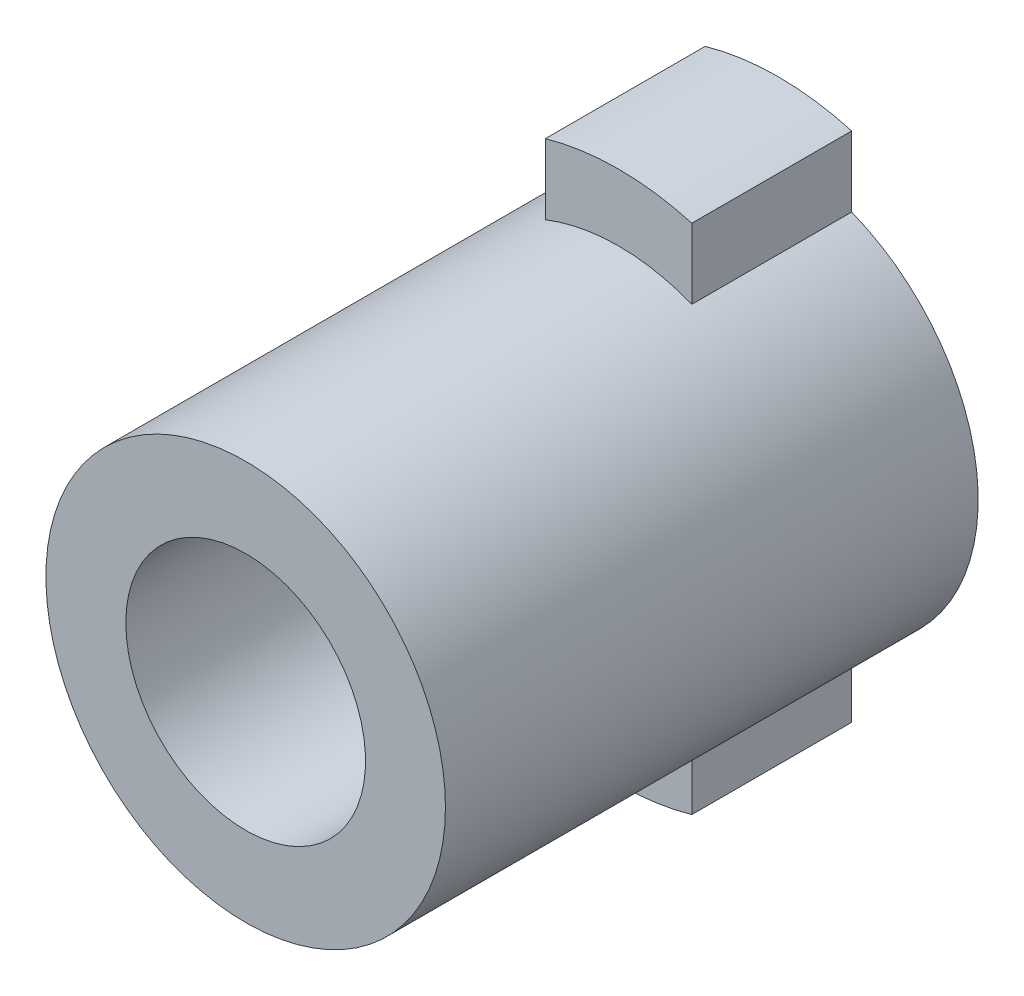
ISO-10303-21;
HEADER;
FILE_DESCRIPTION(('STEP AP214'),'2;1');
FILE_NAME('part.step','',(''),(''),'','','');
FILE_SCHEMA(('AUTOMOTIVE_DESIGN { 1 0 10303 214 1 1 1 1 }'));
ENDSEC;
DATA;
#1=APPLICATION_CONTEXT('core data for automotive mechanical design processes');
#2=APPLICATION_PROTOCOL_DEFINITION('international standard','automotive_design',2000,#1);
#3=PRODUCT_CONTEXT('',#1,'mechanical');
#4=PRODUCT('Part','Part','',(#3));
#5=PRODUCT_RELATED_PRODUCT_CATEGORY('part','',(#4));
#6=PRODUCT_DEFINITION_FORMATION('','',#4);
#7=PRODUCT_DEFINITION_CONTEXT('part definition',#1,'design');
#8=PRODUCT_DEFINITION('design','',#6,#7);
#9=PRODUCT_DEFINITION_SHAPE('','',#8);
#10=(LENGTH_UNIT() NAMED_UNIT(*) SI_UNIT(.MILLI.,.METRE.));
#11=(NAMED_UNIT(*) PLANE_ANGLE_UNIT() SI_UNIT($,.RADIAN.));
#12=(NAMED_UNIT(*) SI_UNIT($,.STERADIAN.) SOLID_ANGLE_UNIT());
#13=UNCERTAINTY_MEASURE_WITH_UNIT(LENGTH_MEASURE(1.E-05),#10,'distance_accuracy_value','');
#14=(GEOMETRIC_REPRESENTATION_CONTEXT(3) GLOBAL_UNCERTAINTY_ASSIGNED_CONTEXT((#13)) GLOBAL_UNIT_ASSIGNED_CONTEXT((#10,
#11,#12)) REPRESENTATION_CONTEXT('',''));
#15=CARTESIAN_POINT('',(0.,0.,0.));
#16=DIRECTION('',(0.,0.,1.));
#17=DIRECTION('',(1.,0.,0.));
#18=AXIS2_PLACEMENT_3D('',#15,#16,#17);
#19=CARTESIAN_POINT('',(0.,0.,20.));
#20=DIRECTION('',(0.,0.,-1.));
#21=DIRECTION('',(-1.,0.,0.));
#22=AXIS2_PLACEMENT_3D('',#19,#20,#21);
#23=CYLINDRICAL_SURFACE('',#22,7.5);
#24=CARTESIAN_POINT('',(0.,0.,0.));
#25=DIRECTION('',(0.,0.,1.));
#26=DIRECTION('',(1.,0.,0.));
#27=AXIS2_PLACEMENT_3D('',#24,#25,#26);
#28=CIRCLE('',#27,7.5);
#29=CARTESIAN_POINT('',(2.75,-6.97764286847643,0.));
#30=VERTEX_POINT('',#29);
#31=CARTESIAN_POINT('',(2.75,6.97764286847643,0.));
#32=VERTEX_POINT('',#31);
#33=EDGE_CURVE('E180',#30,#32,#28,.T.);
#34=ORIENTED_EDGE('',*,*,#33,.T.);
#35=DIRECTION('',(0.,0.,-1.));
#36=VECTOR('',#35,1.);
#37=CARTESIAN_POINT('',(2.75,6.97764286847643,20.));
#38=LINE('',#37,#36);
#39=CARTESIAN_POINT('',(2.75,6.97764286847643,6.));
#40=VERTEX_POINT('',#39);
#41=EDGE_CURVE('E57',#32,#40,#38,.F.);
#42=ORIENTED_EDGE('',*,*,#41,.T.);
#43=CARTESIAN_POINT('',(0.,0.,6.));
#44=DIRECTION('',(0.,0.,1.));
#45=DIRECTION('',(1.,0.,0.));
#46=AXIS2_PLACEMENT_3D('',#43,#44,#45);
#47=CIRCLE('',#46,7.5);
#48=CARTESIAN_POINT('',(-2.75,6.97764286847643,6.));
#49=VERTEX_POINT('',#48);
#50=EDGE_CURVE('E11',#40,#49,#47,.T.);
#51=ORIENTED_EDGE('',*,*,#50,.T.);
#52=DIRECTION('',(0.,0.,-1.));
#53=VECTOR('',#52,1.);
#54=CARTESIAN_POINT('',(-2.75,6.97764286847643,20.));
#55=LINE('',#54,#53);
#56=CARTESIAN_POINT('',(-2.75,6.97764286847643,0.));
#57=VERTEX_POINT('',#56);
#58=EDGE_CURVE('E171',#49,#57,#55,.T.);
#59=ORIENTED_EDGE('',*,*,#58,.T.);
#60=CARTESIAN_POINT('',(-2.75,-6.97764286847643,0.));
#61=VERTEX_POINT('',#60);
#62=EDGE_CURVE('E184',#57,#61,#28,.T.);
#63=ORIENTED_EDGE('',*,*,#62,.T.);
#64=DIRECTION('',(0.,0.,-1.));
#65=VECTOR('',#64,1.);
#66=CARTESIAN_POINT('',(-2.75,-6.97764286847643,20.));
#67=LINE('',#66,#65);
#68=CARTESIAN_POINT('',(-2.75,-6.97764286847643,6.));
#69=VERTEX_POINT('',#68);
#70=EDGE_CURVE('E162',#61,#69,#67,.F.);
#71=ORIENTED_EDGE('',*,*,#70,.T.);
#72=CARTESIAN_POINT('',(2.75,-6.97764286847643,6.));
#73=VERTEX_POINT('',#72);
#74=EDGE_CURVE('E42',#69,#73,#47,.T.);
#75=ORIENTED_EDGE('',*,*,#74,.T.);
#76=DIRECTION('',(0.,0.,-1.));
#77=VECTOR('',#76,1.);
#78=CARTESIAN_POINT('',(2.75,-6.97764286847643,20.));
#79=LINE('',#78,#77);
#80=EDGE_CURVE('E176',#73,#30,#79,.T.);
#81=ORIENTED_EDGE('',*,*,#80,.T.);
#82=EDGE_LOOP('',(#34,#42,#51,#59,#63,#71,#75,#81));
#83=FACE_BOUND('',#82,.T.);
#84=CARTESIAN_POINT('',(0.,0.,20.));
#85=DIRECTION('',(0.,0.,1.));
#86=DIRECTION('',(1.,0.,0.));
#87=AXIS2_PLACEMENT_3D('',#84,#85,#86);
#88=CIRCLE('',#87,7.5);
#89=CARTESIAN_POINT('',(7.5,0.,20.));
#90=VERTEX_POINT('',#89);
#91=EDGE_CURVE('E181',#90,#90,#88,.T.);
#92=ORIENTED_EDGE('',*,*,#91,.F.);
#93=EDGE_LOOP('',(#92));
#94=FACE_BOUND('',#93,.T.);
#95=ADVANCED_FACE('F39',(#83,#94),#23,.T.);
#96=CARTESIAN_POINT('',(0.,0.,20.));
#97=DIRECTION('',(0.,0.,1.));
#98=DIRECTION('',(1.,0.,0.));
#99=AXIS2_PLACEMENT_3D('',#96,#97,#98);
#100=PLANE('',#99);
#101=CARTESIAN_POINT('',(0.,0.,20.));
#102=DIRECTION('',(0.,0.,-1.));
#103=DIRECTION('',(-1.,0.,0.));
#104=AXIS2_PLACEMENT_3D('',#101,#102,#103);
#105=CIRCLE('',#104,4.5);
#106=CARTESIAN_POINT('',(-4.5,0.,20.));
#107=VERTEX_POINT('',#106);
#108=EDGE_CURVE('E153',#107,#107,#105,.T.);
#109=ORIENTED_EDGE('',*,*,#108,.T.);
#110=EDGE_LOOP('',(#109));
#111=FACE_BOUND('',#110,.T.);
#112=ORIENTED_EDGE('',*,*,#91,.T.);
#113=EDGE_LOOP('',(#112));
#114=FACE_BOUND('',#113,.T.);
#115=ADVANCED_FACE('F214',(#111,#114),#100,.T.);
#116=CARTESIAN_POINT('',(0.,0.,0.));
#117=DIRECTION('',(0.,0.,1.));
#118=DIRECTION('',(1.,0.,0.));
#119=AXIS2_PLACEMENT_3D('',#116,#117,#118);
#120=PLANE('',#119);
#121=CARTESIAN_POINT('',(0.,0.,0.));
#122=DIRECTION('',(0.,0.,-1.));
#123=DIRECTION('',(-1.,0.,0.));
#124=AXIS2_PLACEMENT_3D('',#121,#122,#123);
#125=CIRCLE('',#124,4.5);
#126=CARTESIAN_POINT('',(-4.5,0.,0.));
#127=VERTEX_POINT('',#126);
#128=EDGE_CURVE('E139',#127,#127,#125,.T.);
#129=ORIENTED_EDGE('',*,*,#128,.F.);
#130=EDGE_LOOP('',(#129));
#131=FACE_BOUND('',#130,.T.);
#132=ORIENTED_EDGE('',*,*,#62,.F.);
#133=DIRECTION('',(0.,1.,0.));
#134=VECTOR('',#133,1.);
#135=CARTESIAN_POINT('',(-2.75,-9.61444226151471,0.));
#136=LINE('',#135,#134);
#137=CARTESIAN_POINT('',(-2.75,9.61444226151471,0.));
#138=VERTEX_POINT('',#137);
#139=EDGE_CURVE('E152',#57,#138,#136,.T.);
#140=ORIENTED_EDGE('',*,*,#139,.T.);
#141=CARTESIAN_POINT('',(0.,0.,0.));
#142=DIRECTION('',(0.,0.,-1.));
#143=DIRECTION('',(-1.,0.,0.));
#144=AXIS2_PLACEMENT_3D('',#141,#142,#143);
#145=CIRCLE('',#144,10.);
#146=CARTESIAN_POINT('',(2.75,9.61444226151471,0.));
#147=VERTEX_POINT('',#146);
#148=EDGE_CURVE('E156',#138,#147,#145,.T.);
#149=ORIENTED_EDGE('',*,*,#148,.T.);
#150=DIRECTION('',(0.,-1.,0.));
#151=VECTOR('',#150,1.);
#152=CARTESIAN_POINT('',(2.75,-9.61444226151471,0.));
#153=LINE('',#152,#151);
#154=EDGE_CURVE('E131',#147,#32,#153,.T.);
#155=ORIENTED_EDGE('',*,*,#154,.T.);
#156=ORIENTED_EDGE('',*,*,#33,.F.);
#157=CARTESIAN_POINT('',(2.75,-9.61444226151471,0.));
#158=VERTEX_POINT('',#157);
#159=EDGE_CURVE('E136',#30,#158,#153,.T.);
#160=ORIENTED_EDGE('',*,*,#159,.T.);
#161=CARTESIAN_POINT('',(0.,0.,0.));
#162=DIRECTION('',(0.,0.,-1.));
#163=DIRECTION('',(1.,0.,0.));
#164=AXIS2_PLACEMENT_3D('',#161,#162,#163);
#165=CIRCLE('',#164,10.);
#166=CARTESIAN_POINT('',(-2.75,-9.61444226151471,0.));
#167=VERTEX_POINT('',#166);
#168=EDGE_CURVE('E149',#158,#167,#165,.T.);
#169=ORIENTED_EDGE('',*,*,#168,.T.);
#170=EDGE_CURVE('E107',#167,#61,#136,.T.);
#171=ORIENTED_EDGE('',*,*,#170,.T.);
#172=EDGE_LOOP('',(#132,#140,#149,#155,#156,#160,#169,#171));
#173=FACE_BOUND('',#172,.T.);
#174=ADVANCED_FACE('F190',(#131,#173),#120,.F.);
#175=CARTESIAN_POINT('',(0.,0.,6.));
#176=DIRECTION('',(0.,0.,-1.));
#177=DIRECTION('',(-1.,0.,0.));
#178=AXIS2_PLACEMENT_3D('',#175,#176,#177);
#179=CYLINDRICAL_SURFACE('',#178,10.);
#180=ORIENTED_EDGE('',*,*,#168,.F.);
#181=DIRECTION('',(0.,0.,-1.));
#182=VECTOR('',#181,1.);
#183=CARTESIAN_POINT('',(2.75,-9.61444226151471,6.));
#184=LINE('',#183,#182);
#185=CARTESIAN_POINT('',(2.75,-9.61444226151471,6.));
#186=VERTEX_POINT('',#185);
#187=EDGE_CURVE('E129',#186,#158,#184,.T.);
#188=ORIENTED_EDGE('',*,*,#187,.F.);
#189=CARTESIAN_POINT('',(0.,0.,6.));
#190=DIRECTION('',(0.,0.,-1.));
#191=DIRECTION('',(1.,0.,0.));
#192=AXIS2_PLACEMENT_3D('',#189,#190,#191);
#193=CIRCLE('',#192,10.);
#194=CARTESIAN_POINT('',(-2.75,-9.61444226151471,6.));
#195=VERTEX_POINT('',#194);
#196=EDGE_CURVE('E121',#186,#195,#193,.T.);
#197=ORIENTED_EDGE('',*,*,#196,.T.);
#198=DIRECTION('',(0.,0.,-1.));
#199=VECTOR('',#198,1.);
#200=CARTESIAN_POINT('',(-2.75,-9.61444226151471,6.));
#201=LINE('',#200,#199);
#202=EDGE_CURVE('E101',#195,#167,#201,.T.);
#203=ORIENTED_EDGE('',*,*,#202,.T.);
#204=EDGE_LOOP('',(#180,#188,#197,#203));
#205=FACE_BOUND('',#204,.T.);
#206=ADVANCED_FACE('F127',(#205),#179,.T.);
#207=CARTESIAN_POINT('',(0.,0.,6.));
#208=DIRECTION('',(0.,0.,1.));
#209=DIRECTION('',(1.,0.,0.));
#210=AXIS2_PLACEMENT_3D('',#207,#208,#209);
#211=PLANE('',#210);
#212=ORIENTED_EDGE('',*,*,#74,.F.);
#213=DIRECTION('',(0.,1.,0.));
#214=VECTOR('',#213,1.);
#215=CARTESIAN_POINT('',(-2.75,-9.61444226151471,6.));
#216=LINE('',#215,#214);
#217=EDGE_CURVE('E105',#195,#69,#216,.T.);
#218=ORIENTED_EDGE('',*,*,#217,.F.);
#219=ORIENTED_EDGE('',*,*,#196,.F.);
#220=DIRECTION('',(0.,-1.,0.));
#221=VECTOR('',#220,1.);
#222=CARTESIAN_POINT('',(2.75,-9.61444226151471,6.));
#223=LINE('',#222,#221);
#224=EDGE_CURVE('E145',#73,#186,#223,.T.);
#225=ORIENTED_EDGE('',*,*,#224,.F.);
#226=EDGE_LOOP('',(#212,#218,#219,#225));
#227=FACE_BOUND('',#226,.T.);
#228=ADVANCED_FACE('F119',(#227),#211,.T.);
#229=CARTESIAN_POINT('',(-2.75,-9.61444226151471,6.));
#230=DIRECTION('',(-1.,0.,0.));
#231=DIRECTION('',(0.,0.,1.));
#232=AXIS2_PLACEMENT_3D('',#229,#230,#231);
#233=PLANE('',#232);
#234=ORIENTED_EDGE('',*,*,#70,.F.);
#235=ORIENTED_EDGE('',*,*,#170,.F.);
#236=ORIENTED_EDGE('',*,*,#202,.F.);
#237=ORIENTED_EDGE('',*,*,#217,.T.);
#238=EDGE_LOOP('',(#234,#235,#236,#237));
#239=FACE_BOUND('',#238,.T.);
#240=ADVANCED_FACE('F104',(#239),#233,.T.);
#241=CARTESIAN_POINT('',(2.75,-9.61444226151471,6.));
#242=DIRECTION('',(1.,0.,0.));
#243=DIRECTION('',(0.,0.,-1.));
#244=AXIS2_PLACEMENT_3D('',#241,#242,#243);
#245=PLANE('',#244);
#246=ORIENTED_EDGE('',*,*,#80,.F.);
#247=ORIENTED_EDGE('',*,*,#224,.T.);
#248=ORIENTED_EDGE('',*,*,#187,.T.);
#249=ORIENTED_EDGE('',*,*,#159,.F.);
#250=EDGE_LOOP('',(#246,#247,#248,#249));
#251=FACE_BOUND('',#250,.T.);
#252=ADVANCED_FACE('F195',(#251),#245,.T.);
#253=ORIENTED_EDGE('',*,*,#50,.F.);
#254=CARTESIAN_POINT('',(2.75,9.61444226151471,6.));
#255=VERTEX_POINT('',#254);
#256=EDGE_CURVE('E114',#255,#40,#223,.T.);
#257=ORIENTED_EDGE('',*,*,#256,.F.);
#258=CARTESIAN_POINT('',(0.,0.,6.));
#259=DIRECTION('',(0.,0.,-1.));
#260=DIRECTION('',(-1.,0.,0.));
#261=AXIS2_PLACEMENT_3D('',#258,#259,#260);
#262=CIRCLE('',#261,10.);
#263=CARTESIAN_POINT('',(-2.75,9.61444226151471,6.));
#264=VERTEX_POINT('',#263);
#265=EDGE_CURVE('E123',#264,#255,#262,.T.);
#266=ORIENTED_EDGE('',*,*,#265,.F.);
#267=EDGE_CURVE('E124',#49,#264,#216,.T.);
#268=ORIENTED_EDGE('',*,*,#267,.F.);
#269=EDGE_LOOP('',(#253,#257,#266,#268));
#270=FACE_BOUND('',#269,.T.);
#271=ADVANCED_FACE('F199',(#270),#211,.T.);
#272=ORIENTED_EDGE('',*,*,#41,.F.);
#273=ORIENTED_EDGE('',*,*,#154,.F.);
#274=DIRECTION('',(0.,0.,-1.));
#275=VECTOR('',#274,1.);
#276=CARTESIAN_POINT('',(2.75,9.61444226151471,6.));
#277=LINE('',#276,#275);
#278=EDGE_CURVE('E163',#255,#147,#277,.T.);
#279=ORIENTED_EDGE('',*,*,#278,.F.);
#280=ORIENTED_EDGE('',*,*,#256,.T.);
#281=EDGE_LOOP('',(#272,#273,#279,#280));
#282=FACE_BOUND('',#281,.T.);
#283=ADVANCED_FACE('F201',(#282),#245,.T.);
#284=ORIENTED_EDGE('',*,*,#58,.F.);
#285=ORIENTED_EDGE('',*,*,#267,.T.);
#286=DIRECTION('',(0.,0.,-1.));
#287=VECTOR('',#286,1.);
#288=CARTESIAN_POINT('',(-2.75,9.61444226151471,6.));
#289=LINE('',#288,#287);
#290=EDGE_CURVE('E113',#264,#138,#289,.T.);
#291=ORIENTED_EDGE('',*,*,#290,.T.);
#292=ORIENTED_EDGE('',*,*,#139,.F.);
#293=EDGE_LOOP('',(#284,#285,#291,#292));
#294=FACE_BOUND('',#293,.T.);
#295=ADVANCED_FACE('F209',(#294),#233,.T.);
#296=CARTESIAN_POINT('',(0.,0.,6.));
#297=DIRECTION('',(0.,0.,-1.));
#298=DIRECTION('',(-1.,0.,0.));
#299=AXIS2_PLACEMENT_3D('',#296,#297,#298);
#300=CYLINDRICAL_SURFACE('',#299,10.);
#301=ORIENTED_EDGE('',*,*,#148,.F.);
#302=ORIENTED_EDGE('',*,*,#290,.F.);
#303=ORIENTED_EDGE('',*,*,#265,.T.);
#304=ORIENTED_EDGE('',*,*,#278,.T.);
#305=EDGE_LOOP('',(#301,#302,#303,#304));
#306=FACE_BOUND('',#305,.T.);
#307=ADVANCED_FACE('F229',(#306),#300,.T.);
#308=CARTESIAN_POINT('',(0.,0.,20.));
#309=DIRECTION('',(0.,0.,-1.));
#310=DIRECTION('',(-1.,0.,0.));
#311=AXIS2_PLACEMENT_3D('',#308,#309,#310);
#312=CYLINDRICAL_SURFACE('',#311,4.5);
#313=ORIENTED_EDGE('',*,*,#108,.F.);
#314=EDGE_LOOP('',(#313));
#315=FACE_BOUND('',#314,.T.);
#316=ORIENTED_EDGE('',*,*,#128,.T.);
#317=EDGE_LOOP('',(#316));
#318=FACE_BOUND('',#317,.T.);
#319=ADVANCED_FACE('F232',(#315,#318),#312,.F.);
#320=CLOSED_SHELL('',(#95,#115,#174,#206,#228,#240,#252,#271,#283,#295,#307,#319));
#321=MANIFOLD_SOLID_BREP('B2',#320);
#322=ADVANCED_BREP_SHAPE_REPRESENTATION('',(#18,#321),#14);
#323=SHAPE_DEFINITION_REPRESENTATION(#9,#322);
ENDSEC;
END-ISO-10303-21;
